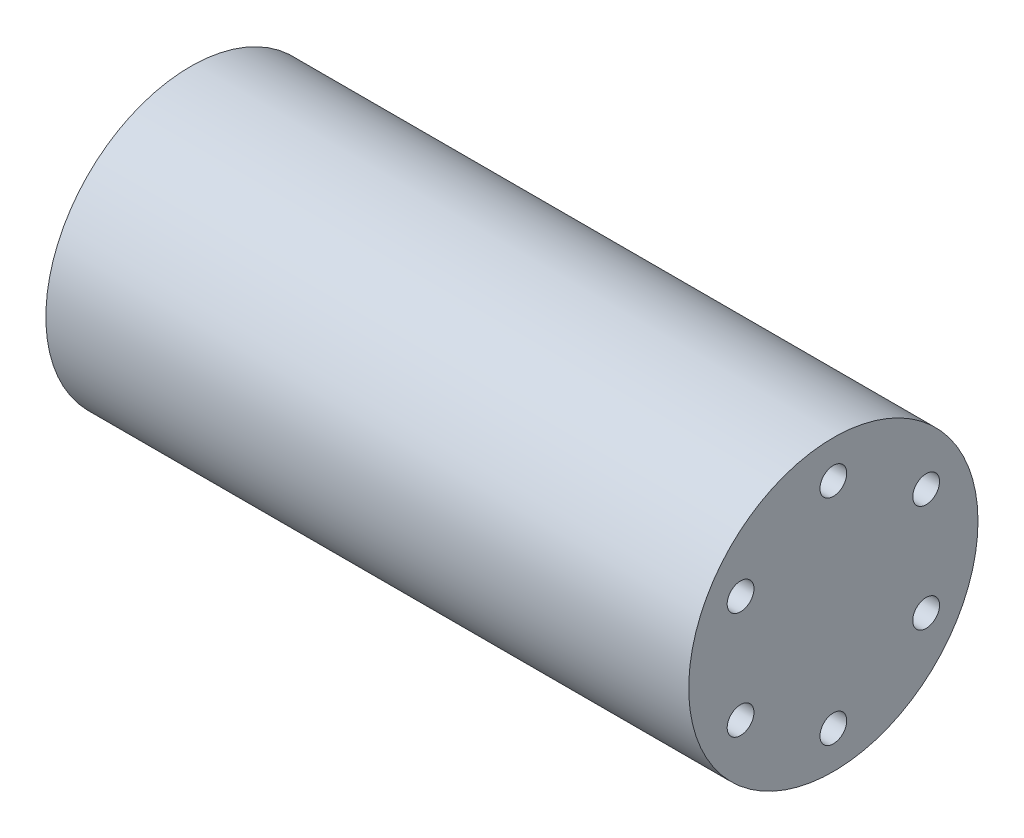
ISO-10303-21;
HEADER;
FILE_DESCRIPTION(('STEP AP214'),'2;1');
FILE_NAME('part.step','',(''),(''),'','','');
FILE_SCHEMA(('AUTOMOTIVE_DESIGN { 1 0 10303 214 1 1 1 1 }'));
ENDSEC;
DATA;
#1=APPLICATION_CONTEXT('core data for automotive mechanical design processes');
#2=APPLICATION_PROTOCOL_DEFINITION('international standard','automotive_design',2000,#1);
#3=PRODUCT_CONTEXT('',#1,'mechanical');
#4=PRODUCT('Part','Part','',(#3));
#5=PRODUCT_RELATED_PRODUCT_CATEGORY('part','',(#4));
#6=PRODUCT_DEFINITION_FORMATION('','',#4);
#7=PRODUCT_DEFINITION_CONTEXT('part definition',#1,'design');
#8=PRODUCT_DEFINITION('design','',#6,#7);
#9=PRODUCT_DEFINITION_SHAPE('','',#8);
#10=(LENGTH_UNIT() NAMED_UNIT(*) SI_UNIT(.MILLI.,.METRE.));
#11=(NAMED_UNIT(*) PLANE_ANGLE_UNIT() SI_UNIT($,.RADIAN.));
#12=(NAMED_UNIT(*) SI_UNIT($,.STERADIAN.) SOLID_ANGLE_UNIT());
#13=UNCERTAINTY_MEASURE_WITH_UNIT(LENGTH_MEASURE(1.E-05),#10,'distance_accuracy_value','');
#14=(GEOMETRIC_REPRESENTATION_CONTEXT(3) GLOBAL_UNCERTAINTY_ASSIGNED_CONTEXT((#13)) GLOBAL_UNIT_ASSIGNED_CONTEXT((#10,
#11,#12)) REPRESENTATION_CONTEXT('',''));
#15=CARTESIAN_POINT('',(0.,0.,0.));
#16=DIRECTION('',(0.,0.,1.));
#17=DIRECTION('',(1.,0.,0.));
#18=AXIS2_PLACEMENT_3D('',#15,#16,#17);
#19=CARTESIAN_POINT('',(15.,0.,0.));
#20=DIRECTION('',(-1.,0.,0.));
#21=DIRECTION('',(0.,0.,1.));
#22=AXIS2_PLACEMENT_3D('',#19,#20,#21);
#23=CYLINDRICAL_SURFACE('',#22,6.75);
#24=CARTESIAN_POINT('',(15.,0.,0.));
#25=DIRECTION('',(1.,0.,0.));
#26=DIRECTION('',(0.,0.,-1.));
#27=AXIS2_PLACEMENT_3D('',#24,#25,#26);
#28=CIRCLE('',#27,6.75);
#29=CARTESIAN_POINT('',(15.,0.,-6.75));
#30=VERTEX_POINT('',#29);
#31=EDGE_CURVE('E10',#30,#30,#28,.T.);
#32=ORIENTED_EDGE('',*,*,#31,.F.);
#33=EDGE_LOOP('',(#32));
#34=FACE_BOUND('',#33,.T.);
#35=CARTESIAN_POINT('',(-15.,0.,0.));
#36=DIRECTION('',(1.,0.,0.));
#37=DIRECTION('',(0.,0.,-1.));
#38=AXIS2_PLACEMENT_3D('',#35,#36,#37);
#39=CIRCLE('',#38,6.75);
#40=CARTESIAN_POINT('',(-15.,0.,-6.75));
#41=VERTEX_POINT('',#40);
#42=EDGE_CURVE('E45',#41,#41,#39,.T.);
#43=ORIENTED_EDGE('',*,*,#42,.T.);
#44=EDGE_LOOP('',(#43));
#45=FACE_BOUND('',#44,.T.);
#46=ADVANCED_FACE('F42',(#34,#45),#23,.T.);
#47=CARTESIAN_POINT('',(15.,0.,0.));
#48=DIRECTION('',(1.,0.,0.));
#49=DIRECTION('',(0.,0.,-1.));
#50=AXIS2_PLACEMENT_3D('',#47,#48,#49);
#51=PLANE('',#50);
#52=CARTESIAN_POINT('',(15.,5.,0.));
#53=DIRECTION('',(-1.,0.,0.));
#54=DIRECTION('',(0.,0.,1.));
#55=AXIS2_PLACEMENT_3D('',#52,#53,#54);
#56=CIRCLE('',#55,0.625);
#57=CARTESIAN_POINT('',(15.,5.,0.625));
#58=VERTEX_POINT('',#57);
#59=EDGE_CURVE('E137',#58,#58,#56,.T.);
#60=ORIENTED_EDGE('',*,*,#59,.T.);
#61=EDGE_LOOP('',(#60));
#62=FACE_BOUND('',#61,.T.);
#63=CARTESIAN_POINT('',(15.,2.50000000000005,-4.33012701892216));
#64=DIRECTION('',(-1.,0.,0.));
#65=DIRECTION('',(0.,0.,1.));
#66=AXIS2_PLACEMENT_3D('',#63,#64,#65);
#67=CIRCLE('',#66,0.625);
#68=CARTESIAN_POINT('',(15.,2.50000000000005,-3.70512701892216));
#69=VERTEX_POINT('',#68);
#70=EDGE_CURVE('E138',#69,#69,#67,.T.);
#71=ORIENTED_EDGE('',*,*,#70,.T.);
#72=EDGE_LOOP('',(#71));
#73=FACE_BOUND('',#72,.T.);
#74=CARTESIAN_POINT('',(15.,-2.49999999999996,-4.33012701892221));
#75=DIRECTION('',(-1.,0.,0.));
#76=DIRECTION('',(0.,0.,1.));
#77=AXIS2_PLACEMENT_3D('',#74,#75,#76);
#78=CIRCLE('',#77,0.625);
#79=CARTESIAN_POINT('',(15.,-2.49999999999996,-3.70512701892222));
#80=VERTEX_POINT('',#79);
#81=EDGE_CURVE('E104',#80,#80,#78,.T.);
#82=ORIENTED_EDGE('',*,*,#81,.T.);
#83=EDGE_LOOP('',(#82));
#84=FACE_BOUND('',#83,.T.);
#85=CARTESIAN_POINT('',(15.,-5.,0.));
#86=DIRECTION('',(-1.,0.,0.));
#87=DIRECTION('',(0.,0.,1.));
#88=AXIS2_PLACEMENT_3D('',#85,#86,#87);
#89=CIRCLE('',#88,0.625);
#90=CARTESIAN_POINT('',(15.,-5.,0.624999999999965));
#91=VERTEX_POINT('',#90);
#92=EDGE_CURVE('E113',#91,#91,#89,.T.);
#93=ORIENTED_EDGE('',*,*,#92,.T.);
#94=EDGE_LOOP('',(#93));
#95=FACE_BOUND('',#94,.T.);
#96=CARTESIAN_POINT('',(15.,-2.50000000000002,4.33012701892218));
#97=DIRECTION('',(-1.,0.,0.));
#98=DIRECTION('',(0.,0.,1.));
#99=AXIS2_PLACEMENT_3D('',#96,#97,#98);
#100=CIRCLE('',#99,0.625000000000001);
#101=CARTESIAN_POINT('',(15.,-2.50000000000002,4.95512701892218));
#102=VERTEX_POINT('',#101);
#103=EDGE_CURVE('E121',#102,#102,#100,.T.);
#104=ORIENTED_EDGE('',*,*,#103,.T.);
#105=EDGE_LOOP('',(#104));
#106=FACE_BOUND('',#105,.T.);
#107=CARTESIAN_POINT('',(15.,2.49999999999999,4.3301270189222));
#108=DIRECTION('',(-1.,0.,0.));
#109=DIRECTION('',(0.,0.,1.));
#110=AXIS2_PLACEMENT_3D('',#107,#108,#109);
#111=CIRCLE('',#110,0.625);
#112=CARTESIAN_POINT('',(15.,2.49999999999999,4.9551270189222));
#113=VERTEX_POINT('',#112);
#114=EDGE_CURVE('E129',#113,#113,#111,.T.);
#115=ORIENTED_EDGE('',*,*,#114,.T.);
#116=EDGE_LOOP('',(#115));
#117=FACE_BOUND('',#116,.T.);
#118=ORIENTED_EDGE('',*,*,#31,.T.);
#119=EDGE_LOOP('',(#118));
#120=FACE_BOUND('',#119,.T.);
#121=ADVANCED_FACE('F164',(#62,#73,#84,#95,#106,#117,#120),#51,.T.);
#122=CARTESIAN_POINT('',(-15.,0.,0.));
#123=DIRECTION('',(1.,0.,0.));
#124=DIRECTION('',(0.,0.,-1.));
#125=AXIS2_PLACEMENT_3D('',#122,#123,#124);
#126=PLANE('',#125);
#127=CARTESIAN_POINT('',(-15.,5.,0.));
#128=DIRECTION('',(-1.,0.,0.));
#129=DIRECTION('',(0.,0.,1.));
#130=AXIS2_PLACEMENT_3D('',#127,#128,#129);
#131=CIRCLE('',#130,0.625);
#132=CARTESIAN_POINT('',(-15.,5.,0.625));
#133=VERTEX_POINT('',#132);
#134=EDGE_CURVE('E89',#133,#133,#131,.T.);
#135=ORIENTED_EDGE('',*,*,#134,.F.);
#136=EDGE_LOOP('',(#135));
#137=FACE_BOUND('',#136,.T.);
#138=CARTESIAN_POINT('',(-15.,2.50000000000005,-4.33012701892216));
#139=DIRECTION('',(-1.,0.,0.));
#140=DIRECTION('',(0.,0.,1.));
#141=AXIS2_PLACEMENT_3D('',#138,#139,#140);
#142=CIRCLE('',#141,0.625);
#143=CARTESIAN_POINT('',(-15.,2.50000000000005,-3.70512701892216));
#144=VERTEX_POINT('',#143);
#145=EDGE_CURVE('E61',#144,#144,#142,.T.);
#146=ORIENTED_EDGE('',*,*,#145,.F.);
#147=EDGE_LOOP('',(#146));
#148=FACE_BOUND('',#147,.T.);
#149=CARTESIAN_POINT('',(-15.,-2.49999999999996,-4.33012701892221));
#150=DIRECTION('',(-1.,0.,0.));
#151=DIRECTION('',(0.,0.,1.));
#152=AXIS2_PLACEMENT_3D('',#149,#150,#151);
#153=CIRCLE('',#152,0.625);
#154=CARTESIAN_POINT('',(-15.,-2.49999999999996,-3.70512701892222));
#155=VERTEX_POINT('',#154);
#156=EDGE_CURVE('E60',#155,#155,#153,.T.);
#157=ORIENTED_EDGE('',*,*,#156,.F.);
#158=EDGE_LOOP('',(#157));
#159=FACE_BOUND('',#158,.T.);
#160=CARTESIAN_POINT('',(-15.,-5.,0.));
#161=DIRECTION('',(-1.,0.,0.));
#162=DIRECTION('',(0.,0.,1.));
#163=AXIS2_PLACEMENT_3D('',#160,#161,#162);
#164=CIRCLE('',#163,0.625);
#165=CARTESIAN_POINT('',(-15.,-5.,0.624999999999965));
#166=VERTEX_POINT('',#165);
#167=EDGE_CURVE('E69',#166,#166,#164,.T.);
#168=ORIENTED_EDGE('',*,*,#167,.F.);
#169=EDGE_LOOP('',(#168));
#170=FACE_BOUND('',#169,.T.);
#171=CARTESIAN_POINT('',(-15.,-2.50000000000002,4.33012701892218));
#172=DIRECTION('',(-1.,0.,0.));
#173=DIRECTION('',(0.,0.,1.));
#174=AXIS2_PLACEMENT_3D('',#171,#172,#173);
#175=CIRCLE('',#174,0.625000000000001);
#176=CARTESIAN_POINT('',(-15.,-2.50000000000002,4.95512701892218));
#177=VERTEX_POINT('',#176);
#178=EDGE_CURVE('E77',#177,#177,#175,.T.);
#179=ORIENTED_EDGE('',*,*,#178,.F.);
#180=EDGE_LOOP('',(#179));
#181=FACE_BOUND('',#180,.T.);
#182=CARTESIAN_POINT('',(-15.,2.49999999999999,4.3301270189222));
#183=DIRECTION('',(-1.,0.,0.));
#184=DIRECTION('',(0.,0.,1.));
#185=AXIS2_PLACEMENT_3D('',#182,#183,#184);
#186=CIRCLE('',#185,0.625);
#187=CARTESIAN_POINT('',(-15.,2.49999999999999,4.9551270189222));
#188=VERTEX_POINT('',#187);
#189=EDGE_CURVE('E85',#188,#188,#186,.T.);
#190=ORIENTED_EDGE('',*,*,#189,.F.);
#191=EDGE_LOOP('',(#190));
#192=FACE_BOUND('',#191,.T.);
#193=ORIENTED_EDGE('',*,*,#42,.F.);
#194=EDGE_LOOP('',(#193));
#195=FACE_BOUND('',#194,.T.);
#196=ADVANCED_FACE('F169',(#137,#148,#159,#170,#181,#192,#195),#126,.F.);
#197=CARTESIAN_POINT('',(-13.,2.49999999999999,4.3301270189222));
#198=DIRECTION('',(-1.,0.,0.));
#199=DIRECTION('',(0.,0.,1.));
#200=AXIS2_PLACEMENT_3D('',#197,#198,#199);
#201=CYLINDRICAL_SURFACE('',#200,0.625);
#202=CARTESIAN_POINT('',(-13.,2.49999999999999,4.3301270189222));
#203=DIRECTION('',(-1.,0.,0.));
#204=DIRECTION('',(0.,0.,1.));
#205=AXIS2_PLACEMENT_3D('',#202,#203,#204);
#206=CIRCLE('',#205,0.625);
#207=CARTESIAN_POINT('',(-13.,2.49999999999999,4.9551270189222));
#208=VERTEX_POINT('',#207);
#209=EDGE_CURVE('E81',#208,#208,#206,.T.);
#210=ORIENTED_EDGE('',*,*,#209,.F.);
#211=EDGE_LOOP('',(#210));
#212=FACE_BOUND('',#211,.T.);
#213=ORIENTED_EDGE('',*,*,#189,.T.);
#214=EDGE_LOOP('',(#213));
#215=FACE_BOUND('',#214,.T.);
#216=ADVANCED_FACE('F176',(#212,#215),#201,.F.);
#217=CARTESIAN_POINT('',(-13.,2.49999999999999,4.3301270189222));
#218=DIRECTION('',(-1.,0.,0.));
#219=DIRECTION('',(0.,0.,1.));
#220=AXIS2_PLACEMENT_3D('',#217,#218,#219);
#221=PLANE('',#220);
#222=ORIENTED_EDGE('',*,*,#209,.T.);
#223=EDGE_LOOP('',(#222));
#224=FACE_BOUND('',#223,.T.);
#225=ADVANCED_FACE('F181',(#224),#221,.T.);
#226=CARTESIAN_POINT('',(-13.,-2.50000000000002,4.33012701892218));
#227=DIRECTION('',(-1.,0.,0.));
#228=DIRECTION('',(0.,0.,1.));
#229=AXIS2_PLACEMENT_3D('',#226,#227,#228);
#230=CYLINDRICAL_SURFACE('',#229,0.625000000000001);
#231=CARTESIAN_POINT('',(-13.,-2.50000000000002,4.33012701892218));
#232=DIRECTION('',(-1.,0.,0.));
#233=DIRECTION('',(0.,0.,1.));
#234=AXIS2_PLACEMENT_3D('',#231,#232,#233);
#235=CIRCLE('',#234,0.625000000000001);
#236=CARTESIAN_POINT('',(-13.,-2.50000000000002,4.95512701892218));
#237=VERTEX_POINT('',#236);
#238=EDGE_CURVE('E73',#237,#237,#235,.T.);
#239=ORIENTED_EDGE('',*,*,#238,.F.);
#240=EDGE_LOOP('',(#239));
#241=FACE_BOUND('',#240,.T.);
#242=ORIENTED_EDGE('',*,*,#178,.T.);
#243=EDGE_LOOP('',(#242));
#244=FACE_BOUND('',#243,.T.);
#245=ADVANCED_FACE('F207',(#241,#244),#230,.F.);
#246=CARTESIAN_POINT('',(-13.,-2.50000000000002,4.33012701892218));
#247=DIRECTION('',(-1.,0.,0.));
#248=DIRECTION('',(0.,0.,1.));
#249=AXIS2_PLACEMENT_3D('',#246,#247,#248);
#250=PLANE('',#249);
#251=ORIENTED_EDGE('',*,*,#238,.T.);
#252=EDGE_LOOP('',(#251));
#253=FACE_BOUND('',#252,.T.);
#254=ADVANCED_FACE('F203',(#253),#250,.T.);
#255=CARTESIAN_POINT('',(-13.,-5.,0.));
#256=DIRECTION('',(-1.,0.,0.));
#257=DIRECTION('',(0.,0.,1.));
#258=AXIS2_PLACEMENT_3D('',#255,#256,#257);
#259=CYLINDRICAL_SURFACE('',#258,0.625);
#260=CARTESIAN_POINT('',(-13.,-5.,0.));
#261=DIRECTION('',(-1.,0.,0.));
#262=DIRECTION('',(0.,0.,1.));
#263=AXIS2_PLACEMENT_3D('',#260,#261,#262);
#264=CIRCLE('',#263,0.625);
#265=CARTESIAN_POINT('',(-13.,-5.,0.624999999999965));
#266=VERTEX_POINT('',#265);
#267=EDGE_CURVE('E65',#266,#266,#264,.T.);
#268=ORIENTED_EDGE('',*,*,#267,.F.);
#269=EDGE_LOOP('',(#268));
#270=FACE_BOUND('',#269,.T.);
#271=ORIENTED_EDGE('',*,*,#167,.T.);
#272=EDGE_LOOP('',(#271));
#273=FACE_BOUND('',#272,.T.);
#274=ADVANCED_FACE('F199',(#270,#273),#259,.F.);
#275=CARTESIAN_POINT('',(-13.,-5.,0.));
#276=DIRECTION('',(-1.,0.,0.));
#277=DIRECTION('',(0.,0.,1.));
#278=AXIS2_PLACEMENT_3D('',#275,#276,#277);
#279=PLANE('',#278);
#280=ORIENTED_EDGE('',*,*,#267,.T.);
#281=EDGE_LOOP('',(#280));
#282=FACE_BOUND('',#281,.T.);
#283=ADVANCED_FACE('F195',(#282),#279,.T.);
#284=CARTESIAN_POINT('',(-13.,-2.49999999999996,-4.33012701892221));
#285=DIRECTION('',(-1.,0.,0.));
#286=DIRECTION('',(0.,0.,1.));
#287=AXIS2_PLACEMENT_3D('',#284,#285,#286);
#288=CYLINDRICAL_SURFACE('',#287,0.625);
#289=CARTESIAN_POINT('',(-13.,-2.49999999999996,-4.33012701892221));
#290=DIRECTION('',(-1.,0.,0.));
#291=DIRECTION('',(0.,0.,1.));
#292=AXIS2_PLACEMENT_3D('',#289,#290,#291);
#293=CIRCLE('',#292,0.625);
#294=CARTESIAN_POINT('',(-13.,-2.49999999999996,-3.70512701892222));
#295=VERTEX_POINT('',#294);
#296=EDGE_CURVE('E56',#295,#295,#293,.T.);
#297=ORIENTED_EDGE('',*,*,#296,.F.);
#298=EDGE_LOOP('',(#297));
#299=FACE_BOUND('',#298,.T.);
#300=ORIENTED_EDGE('',*,*,#156,.T.);
#301=EDGE_LOOP('',(#300));
#302=FACE_BOUND('',#301,.T.);
#303=ADVANCED_FACE('F191',(#299,#302),#288,.F.);
#304=CARTESIAN_POINT('',(-13.,-2.49999999999996,-4.33012701892221));
#305=DIRECTION('',(-1.,0.,0.));
#306=DIRECTION('',(0.,0.,1.));
#307=AXIS2_PLACEMENT_3D('',#304,#305,#306);
#308=PLANE('',#307);
#309=ORIENTED_EDGE('',*,*,#296,.T.);
#310=EDGE_LOOP('',(#309));
#311=FACE_BOUND('',#310,.T.);
#312=ADVANCED_FACE('F187',(#311),#308,.T.);
#313=CARTESIAN_POINT('',(-13.,2.50000000000005,-4.33012701892216));
#314=DIRECTION('',(-1.,0.,0.));
#315=DIRECTION('',(0.,0.,1.));
#316=AXIS2_PLACEMENT_3D('',#313,#314,#315);
#317=CYLINDRICAL_SURFACE('',#316,0.625);
#318=CARTESIAN_POINT('',(-13.,2.50000000000005,-4.33012701892216));
#319=DIRECTION('',(-1.,0.,0.));
#320=DIRECTION('',(0.,0.,1.));
#321=AXIS2_PLACEMENT_3D('',#318,#319,#320);
#322=CIRCLE('',#321,0.625);
#323=CARTESIAN_POINT('',(-13.,2.50000000000005,-3.70512701892216));
#324=VERTEX_POINT('',#323);
#325=EDGE_CURVE('E90',#324,#324,#322,.T.);
#326=ORIENTED_EDGE('',*,*,#325,.F.);
#327=EDGE_LOOP('',(#326));
#328=FACE_BOUND('',#327,.T.);
#329=ORIENTED_EDGE('',*,*,#145,.T.);
#330=EDGE_LOOP('',(#329));
#331=FACE_BOUND('',#330,.T.);
#332=ADVANCED_FACE('F190',(#328,#331),#317,.F.);
#333=CARTESIAN_POINT('',(-13.,2.50000000000005,-4.33012701892216));
#334=DIRECTION('',(-1.,0.,0.));
#335=DIRECTION('',(0.,0.,1.));
#336=AXIS2_PLACEMENT_3D('',#333,#334,#335);
#337=PLANE('',#336);
#338=ORIENTED_EDGE('',*,*,#325,.T.);
#339=EDGE_LOOP('',(#338));
#340=FACE_BOUND('',#339,.T.);
#341=ADVANCED_FACE('F215',(#340),#337,.T.);
#342=CARTESIAN_POINT('',(-13.,5.,0.));
#343=DIRECTION('',(-1.,0.,0.));
#344=DIRECTION('',(0.,0.,1.));
#345=AXIS2_PLACEMENT_3D('',#342,#343,#344);
#346=CYLINDRICAL_SURFACE('',#345,0.625);
#347=CARTESIAN_POINT('',(-13.,5.,0.));
#348=DIRECTION('',(-1.,0.,0.));
#349=DIRECTION('',(0.,0.,1.));
#350=AXIS2_PLACEMENT_3D('',#347,#348,#349);
#351=CIRCLE('',#350,0.625);
#352=CARTESIAN_POINT('',(-13.,5.,0.625));
#353=VERTEX_POINT('',#352);
#354=EDGE_CURVE('E54',#353,#353,#351,.T.);
#355=ORIENTED_EDGE('',*,*,#354,.F.);
#356=EDGE_LOOP('',(#355));
#357=FACE_BOUND('',#356,.T.);
#358=ORIENTED_EDGE('',*,*,#134,.T.);
#359=EDGE_LOOP('',(#358));
#360=FACE_BOUND('',#359,.T.);
#361=ADVANCED_FACE('F218',(#357,#360),#346,.F.);
#362=CARTESIAN_POINT('',(-13.,5.,0.));
#363=DIRECTION('',(-1.,0.,0.));
#364=DIRECTION('',(0.,0.,1.));
#365=AXIS2_PLACEMENT_3D('',#362,#363,#364);
#366=PLANE('',#365);
#367=ORIENTED_EDGE('',*,*,#354,.T.);
#368=EDGE_LOOP('',(#367));
#369=FACE_BOUND('',#368,.T.);
#370=ADVANCED_FACE('F225',(#369),#366,.T.);
#371=CARTESIAN_POINT('',(13.,2.49999999999999,4.3301270189222));
#372=DIRECTION('',(1.,0.,0.));
#373=DIRECTION('',(0.,0.,-1.));
#374=AXIS2_PLACEMENT_3D('',#371,#372,#373);
#375=CYLINDRICAL_SURFACE('',#374,0.625);
#376=CARTESIAN_POINT('',(13.,2.49999999999999,4.3301270189222));
#377=DIRECTION('',(-1.,0.,0.));
#378=DIRECTION('',(0.,0.,1.));
#379=AXIS2_PLACEMENT_3D('',#376,#377,#378);
#380=CIRCLE('',#379,0.625);
#381=CARTESIAN_POINT('',(13.,2.49999999999999,4.9551270189222));
#382=VERTEX_POINT('',#381);
#383=EDGE_CURVE('E133',#382,#382,#380,.T.);
#384=ORIENTED_EDGE('',*,*,#383,.T.);
#385=EDGE_LOOP('',(#384));
#386=FACE_BOUND('',#385,.T.);
#387=ORIENTED_EDGE('',*,*,#114,.F.);
#388=EDGE_LOOP('',(#387));
#389=FACE_BOUND('',#388,.T.);
#390=ADVANCED_FACE('F229',(#386,#389),#375,.F.);
#391=CARTESIAN_POINT('',(13.,2.49999999999999,4.3301270189222));
#392=DIRECTION('',(1.,0.,0.));
#393=DIRECTION('',(0.,0.,1.));
#394=AXIS2_PLACEMENT_3D('',#391,#392,#393);
#395=PLANE('',#394);
#396=ORIENTED_EDGE('',*,*,#383,.F.);
#397=EDGE_LOOP('',(#396));
#398=FACE_BOUND('',#397,.T.);
#399=ADVANCED_FACE('F252',(#398),#395,.T.);
#400=CARTESIAN_POINT('',(13.,-2.50000000000002,4.33012701892218));
#401=DIRECTION('',(1.,0.,0.));
#402=DIRECTION('',(0.,0.,-1.));
#403=AXIS2_PLACEMENT_3D('',#400,#401,#402);
#404=CYLINDRICAL_SURFACE('',#403,0.625000000000001);
#405=CARTESIAN_POINT('',(13.,-2.50000000000002,4.33012701892218));
#406=DIRECTION('',(-1.,0.,0.));
#407=DIRECTION('',(0.,0.,1.));
#408=AXIS2_PLACEMENT_3D('',#405,#406,#407);
#409=CIRCLE('',#408,0.625000000000001);
#410=CARTESIAN_POINT('',(13.,-2.50000000000002,4.95512701892218));
#411=VERTEX_POINT('',#410);
#412=EDGE_CURVE('E125',#411,#411,#409,.T.);
#413=ORIENTED_EDGE('',*,*,#412,.T.);
#414=EDGE_LOOP('',(#413));
#415=FACE_BOUND('',#414,.T.);
#416=ORIENTED_EDGE('',*,*,#103,.F.);
#417=EDGE_LOOP('',(#416));
#418=FACE_BOUND('',#417,.T.);
#419=ADVANCED_FACE('F249',(#415,#418),#404,.F.);
#420=CARTESIAN_POINT('',(13.,-2.50000000000002,4.33012701892218));
#421=DIRECTION('',(1.,0.,0.));
#422=DIRECTION('',(0.,0.,1.));
#423=AXIS2_PLACEMENT_3D('',#420,#421,#422);
#424=PLANE('',#423);
#425=ORIENTED_EDGE('',*,*,#412,.F.);
#426=EDGE_LOOP('',(#425));
#427=FACE_BOUND('',#426,.T.);
#428=ADVANCED_FACE('F244',(#427),#424,.T.);
#429=CARTESIAN_POINT('',(13.,-5.,0.));
#430=DIRECTION('',(1.,0.,0.));
#431=DIRECTION('',(0.,0.,-1.));
#432=AXIS2_PLACEMENT_3D('',#429,#430,#431);
#433=CYLINDRICAL_SURFACE('',#432,0.625);
#434=CARTESIAN_POINT('',(13.,-5.,0.));
#435=DIRECTION('',(-1.,0.,0.));
#436=DIRECTION('',(0.,0.,1.));
#437=AXIS2_PLACEMENT_3D('',#434,#435,#436);
#438=CIRCLE('',#437,0.625);
#439=CARTESIAN_POINT('',(13.,-5.,0.624999999999965));
#440=VERTEX_POINT('',#439);
#441=EDGE_CURVE('E117',#440,#440,#438,.T.);
#442=ORIENTED_EDGE('',*,*,#441,.T.);
#443=EDGE_LOOP('',(#442));
#444=FACE_BOUND('',#443,.T.);
#445=ORIENTED_EDGE('',*,*,#92,.F.);
#446=EDGE_LOOP('',(#445));
#447=FACE_BOUND('',#446,.T.);
#448=ADVANCED_FACE('F241',(#444,#447),#433,.F.);
#449=CARTESIAN_POINT('',(13.,-5.,0.));
#450=DIRECTION('',(1.,0.,0.));
#451=DIRECTION('',(0.,0.,1.));
#452=AXIS2_PLACEMENT_3D('',#449,#450,#451);
#453=PLANE('',#452);
#454=ORIENTED_EDGE('',*,*,#441,.F.);
#455=EDGE_LOOP('',(#454));
#456=FACE_BOUND('',#455,.T.);
#457=ADVANCED_FACE('F235',(#456),#453,.T.);
#458=CARTESIAN_POINT('',(13.,-2.49999999999996,-4.33012701892221));
#459=DIRECTION('',(1.,0.,0.));
#460=DIRECTION('',(0.,0.,-1.));
#461=AXIS2_PLACEMENT_3D('',#458,#459,#460);
#462=CYLINDRICAL_SURFACE('',#461,0.625);
#463=CARTESIAN_POINT('',(13.,-2.49999999999996,-4.33012701892221));
#464=DIRECTION('',(-1.,0.,0.));
#465=DIRECTION('',(0.,0.,1.));
#466=AXIS2_PLACEMENT_3D('',#463,#464,#465);
#467=CIRCLE('',#466,0.625);
#468=CARTESIAN_POINT('',(13.,-2.49999999999996,-3.70512701892222));
#469=VERTEX_POINT('',#468);
#470=EDGE_CURVE('E108',#469,#469,#467,.T.);
#471=ORIENTED_EDGE('',*,*,#470,.T.);
#472=EDGE_LOOP('',(#471));
#473=FACE_BOUND('',#472,.T.);
#474=ORIENTED_EDGE('',*,*,#81,.F.);
#475=EDGE_LOOP('',(#474));
#476=FACE_BOUND('',#475,.T.);
#477=ADVANCED_FACE('F231',(#473,#476),#462,.F.);
#478=CARTESIAN_POINT('',(13.,-2.49999999999996,-4.33012701892221));
#479=DIRECTION('',(1.,0.,0.));
#480=DIRECTION('',(0.,0.,1.));
#481=AXIS2_PLACEMENT_3D('',#478,#479,#480);
#482=PLANE('',#481);
#483=ORIENTED_EDGE('',*,*,#470,.F.);
#484=EDGE_LOOP('',(#483));
#485=FACE_BOUND('',#484,.T.);
#486=ADVANCED_FACE('F234',(#485),#482,.T.);
#487=CARTESIAN_POINT('',(13.,2.50000000000005,-4.33012701892216));
#488=DIRECTION('',(1.,0.,0.));
#489=DIRECTION('',(0.,0.,-1.));
#490=AXIS2_PLACEMENT_3D('',#487,#488,#489);
#491=CYLINDRICAL_SURFACE('',#490,0.625);
#492=CARTESIAN_POINT('',(13.,2.50000000000005,-4.33012701892216));
#493=DIRECTION('',(-1.,0.,0.));
#494=DIRECTION('',(0.,0.,1.));
#495=AXIS2_PLACEMENT_3D('',#492,#493,#494);
#496=CIRCLE('',#495,0.625);
#497=CARTESIAN_POINT('',(13.,2.50000000000005,-3.70512701892216));
#498=VERTEX_POINT('',#497);
#499=EDGE_CURVE('E109',#498,#498,#496,.T.);
#500=ORIENTED_EDGE('',*,*,#499,.T.);
#501=EDGE_LOOP('',(#500));
#502=FACE_BOUND('',#501,.T.);
#503=ORIENTED_EDGE('',*,*,#70,.F.);
#504=EDGE_LOOP('',(#503));
#505=FACE_BOUND('',#504,.T.);
#506=ADVANCED_FACE('F239',(#502,#505),#491,.F.);
#507=CARTESIAN_POINT('',(13.,2.50000000000005,-4.33012701892216));
#508=DIRECTION('',(1.,0.,0.));
#509=DIRECTION('',(0.,0.,1.));
#510=AXIS2_PLACEMENT_3D('',#507,#508,#509);
#511=PLANE('',#510);
#512=ORIENTED_EDGE('',*,*,#499,.F.);
#513=EDGE_LOOP('',(#512));
#514=FACE_BOUND('',#513,.T.);
#515=ADVANCED_FACE('F161',(#514),#511,.T.);
#516=CARTESIAN_POINT('',(13.,5.,0.));
#517=DIRECTION('',(1.,0.,0.));
#518=DIRECTION('',(0.,0.,-1.));
#519=AXIS2_PLACEMENT_3D('',#516,#517,#518);
#520=CYLINDRICAL_SURFACE('',#519,0.625);
#521=CARTESIAN_POINT('',(13.,5.,0.));
#522=DIRECTION('',(-1.,0.,0.));
#523=DIRECTION('',(0.,0.,1.));
#524=AXIS2_PLACEMENT_3D('',#521,#522,#523);
#525=CIRCLE('',#524,0.625);
#526=CARTESIAN_POINT('',(13.,5.,0.625));
#527=VERTEX_POINT('',#526);
#528=EDGE_CURVE('E94',#527,#527,#525,.T.);
#529=ORIENTED_EDGE('',*,*,#528,.T.);
#530=EDGE_LOOP('',(#529));
#531=FACE_BOUND('',#530,.T.);
#532=ORIENTED_EDGE('',*,*,#59,.F.);
#533=EDGE_LOOP('',(#532));
#534=FACE_BOUND('',#533,.T.);
#535=ADVANCED_FACE('F152',(#531,#534),#520,.F.);
#536=CARTESIAN_POINT('',(13.,5.,0.));
#537=DIRECTION('',(1.,0.,0.));
#538=DIRECTION('',(0.,0.,1.));
#539=AXIS2_PLACEMENT_3D('',#536,#537,#538);
#540=PLANE('',#539);
#541=ORIENTED_EDGE('',*,*,#528,.F.);
#542=EDGE_LOOP('',(#541));
#543=FACE_BOUND('',#542,.T.);
#544=ADVANCED_FACE('F155',(#543),#540,.T.);
#545=CLOSED_SHELL('',(#46,#121,#196,#216,#225,#245,#254,#274,#283,#303,#312,#332,#341,#361,#370,
#390,#399,#419,#428,#448,#457,#477,#486,#506,#515,#535,#544));
#546=MANIFOLD_SOLID_BREP('B2',#545);
#547=ADVANCED_BREP_SHAPE_REPRESENTATION('',(#18,#546),#14);
#548=SHAPE_DEFINITION_REPRESENTATION(#9,#547);
ENDSEC;
END-ISO-10303-21;
